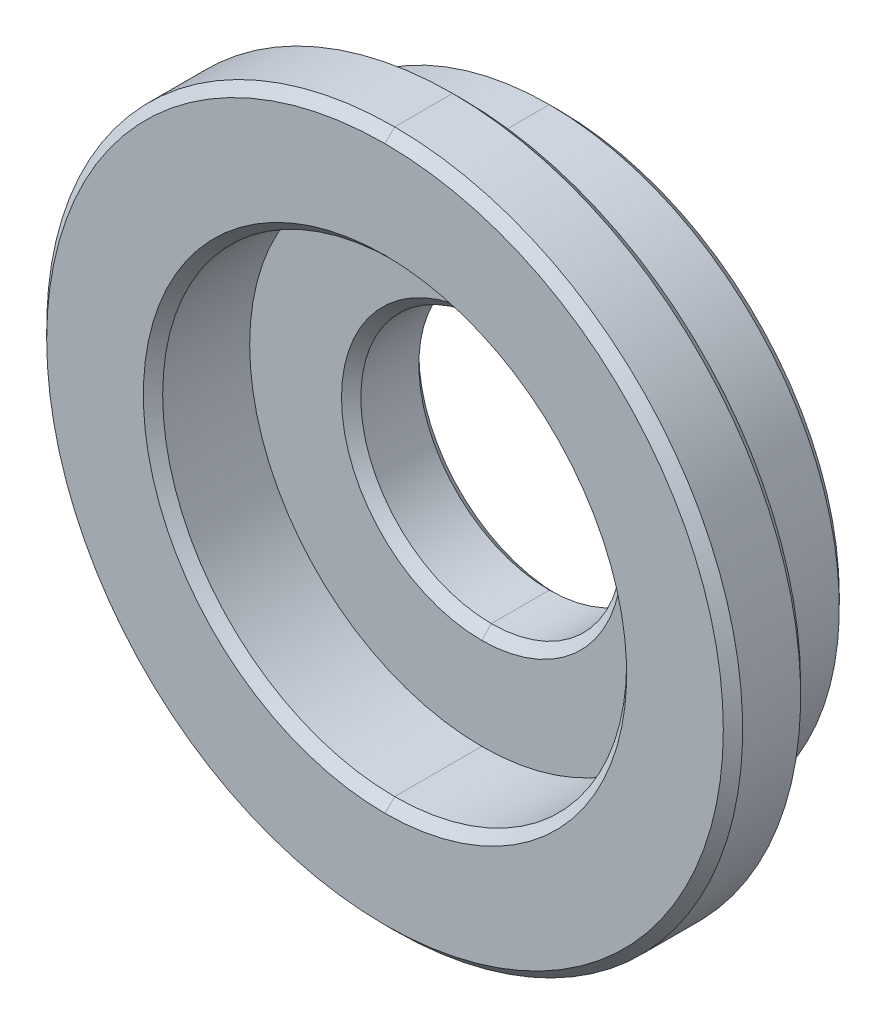
ISO-10303-21;
HEADER;
FILE_DESCRIPTION(('STEP AP214'),'2;1');
FILE_NAME('part.step','',(''),(''),'','','');
FILE_SCHEMA(('AUTOMOTIVE_DESIGN { 1 0 10303 214 1 1 1 1 }'));
ENDSEC;
DATA;
#1=APPLICATION_CONTEXT('core data for automotive mechanical design processes');
#2=APPLICATION_PROTOCOL_DEFINITION('international standard','automotive_design',2000,#1);
#3=PRODUCT_CONTEXT('',#1,'mechanical');
#4=PRODUCT('Part','Part','',(#3));
#5=PRODUCT_RELATED_PRODUCT_CATEGORY('part','',(#4));
#6=PRODUCT_DEFINITION_FORMATION('','',#4);
#7=PRODUCT_DEFINITION_CONTEXT('part definition',#1,'design');
#8=PRODUCT_DEFINITION('design','',#6,#7);
#9=PRODUCT_DEFINITION_SHAPE('','',#8);
#10=(LENGTH_UNIT() NAMED_UNIT(*) SI_UNIT(.MILLI.,.METRE.));
#11=(NAMED_UNIT(*) PLANE_ANGLE_UNIT() SI_UNIT($,.RADIAN.));
#12=(NAMED_UNIT(*) SI_UNIT($,.STERADIAN.) SOLID_ANGLE_UNIT());
#13=UNCERTAINTY_MEASURE_WITH_UNIT(LENGTH_MEASURE(1.E-05),#10,'distance_accuracy_value','');
#14=(GEOMETRIC_REPRESENTATION_CONTEXT(3) GLOBAL_UNCERTAINTY_ASSIGNED_CONTEXT((#13)) GLOBAL_UNIT_ASSIGNED_CONTEXT((#10,
#11,#12)) REPRESENTATION_CONTEXT('',''));
#15=CARTESIAN_POINT('',(0.,0.,0.));
#16=DIRECTION('',(0.,0.,1.));
#17=DIRECTION('',(1.,0.,0.));
#18=AXIS2_PLACEMENT_3D('',#15,#16,#17);
#19=CARTESIAN_POINT('',(0.,0.,-0.25));
#20=DIRECTION('',(0.,0.,1.));
#21=DIRECTION('',(0.,-1.,0.));
#22=AXIS2_PLACEMENT_3D('',#19,#20,#21);
#23=CONICAL_SURFACE('',#22,1.4,0.7853981633973);
#24=DIRECTION('',(0.,-0.707106781186548,0.707106781186548));
#25=VECTOR('',#24,1.);
#26=CARTESIAN_POINT('',(0.,-1.35,-0.3));
#27=LINE('',#26,#25);
#28=CARTESIAN_POINT('',(0.,-1.35,-0.3));
#29=VERTEX_POINT('',#28);
#30=CARTESIAN_POINT('',(0.,-1.45,-0.2));
#31=VERTEX_POINT('',#30);
#32=EDGE_CURVE('E270',#29,#31,#27,.T.);
#33=ORIENTED_EDGE('',*,*,#32,.F.);
#34=CARTESIAN_POINT('',(0.,0.,-0.3));
#35=DIRECTION('',(0.,0.,1.));
#36=DIRECTION('',(0.,1.,0.));
#37=AXIS2_PLACEMENT_3D('',#34,#35,#36);
#38=CIRCLE('',#37,1.35);
#39=CARTESIAN_POINT('',(0.,1.35,-0.3));
#40=VERTEX_POINT('',#39);
#41=EDGE_CURVE('E185',#40,#29,#38,.T.);
#42=ORIENTED_EDGE('',*,*,#41,.F.);
#43=DIRECTION('',(0.,0.707106781186548,0.707106781186548));
#44=VECTOR('',#43,1.);
#45=CARTESIAN_POINT('',(0.,1.35,-0.3));
#46=LINE('',#45,#44);
#47=CARTESIAN_POINT('',(0.,1.45,-0.2));
#48=VERTEX_POINT('',#47);
#49=EDGE_CURVE('E234',#40,#48,#46,.T.);
#50=ORIENTED_EDGE('',*,*,#49,.T.);
#51=CARTESIAN_POINT('',(0.,0.,-0.2));
#52=DIRECTION('',(0.,0.,1.));
#53=DIRECTION('',(0.,1.,0.));
#54=AXIS2_PLACEMENT_3D('',#51,#52,#53);
#55=CIRCLE('',#54,1.45);
#56=EDGE_CURVE('E273',#48,#31,#55,.T.);
#57=ORIENTED_EDGE('',*,*,#56,.T.);
#58=EDGE_LOOP('',(#33,#42,#50,#57));
#59=FACE_BOUND('',#58,.T.);
#60=ADVANCED_FACE('F15',(#59),#23,.F.);
#61=CARTESIAN_POINT('',(0.,0.,0.75));
#62=DIRECTION('',(0.,0.,1.));
#63=DIRECTION('',(0.,-1.,0.));
#64=AXIS2_PLACEMENT_3D('',#61,#62,#63);
#65=CONICAL_SURFACE('',#64,2.45,0.7853981633973);
#66=DIRECTION('',(0.,-0.707106781186548,0.707106781186548));
#67=VECTOR('',#66,1.);
#68=CARTESIAN_POINT('',(0.,-2.4,0.7));
#69=LINE('',#68,#67);
#70=CARTESIAN_POINT('',(0.,-2.4,0.7));
#71=VERTEX_POINT('',#70);
#72=CARTESIAN_POINT('',(0.,-2.5,0.8));
#73=VERTEX_POINT('',#72);
#74=EDGE_CURVE('E295',#71,#73,#69,.T.);
#75=ORIENTED_EDGE('',*,*,#74,.F.);
#76=CARTESIAN_POINT('',(0.,0.,0.7));
#77=DIRECTION('',(0.,0.,1.));
#78=DIRECTION('',(0.,1.,0.));
#79=AXIS2_PLACEMENT_3D('',#76,#77,#78);
#80=CIRCLE('',#79,2.4);
#81=CARTESIAN_POINT('',(0.,2.4,0.7));
#82=VERTEX_POINT('',#81);
#83=EDGE_CURVE('E198',#82,#71,#80,.T.);
#84=ORIENTED_EDGE('',*,*,#83,.F.);
#85=DIRECTION('',(0.,0.707106781186548,0.707106781186548));
#86=VECTOR('',#85,1.);
#87=CARTESIAN_POINT('',(0.,2.4,0.7));
#88=LINE('',#87,#86);
#89=CARTESIAN_POINT('',(0.,2.5,0.8));
#90=VERTEX_POINT('',#89);
#91=EDGE_CURVE('E194',#82,#90,#88,.T.);
#92=ORIENTED_EDGE('',*,*,#91,.T.);
#93=CARTESIAN_POINT('',(0.,0.,0.8));
#94=DIRECTION('',(0.,0.,1.));
#95=DIRECTION('',(0.,1.,0.));
#96=AXIS2_PLACEMENT_3D('',#93,#94,#95);
#97=CIRCLE('',#96,2.5);
#98=EDGE_CURVE('E199',#90,#73,#97,.T.);
#99=ORIENTED_EDGE('',*,*,#98,.T.);
#100=EDGE_LOOP('',(#75,#84,#92,#99));
#101=FACE_BOUND('',#100,.T.);
#102=ADVANCED_FACE('F402',(#101),#65,.F.);
#103=CARTESIAN_POINT('',(0.,0.,0.75));
#104=DIRECTION('',(0.,0.,-1.));
#105=DIRECTION('',(0.,1.,0.));
#106=AXIS2_PLACEMENT_3D('',#103,#104,#105);
#107=CONICAL_SURFACE('',#106,3.55,0.7853981633973);
#108=DIRECTION('',(0.,0.707106781186548,-0.707106781186548));
#109=VECTOR('',#108,1.);
#110=CARTESIAN_POINT('',(0.,3.5,0.8));
#111=LINE('',#110,#109);
#112=CARTESIAN_POINT('',(0.,3.5,0.8));
#113=VERTEX_POINT('',#112);
#114=CARTESIAN_POINT('',(0.,3.6,0.7));
#115=VERTEX_POINT('',#114);
#116=EDGE_CURVE('E211',#113,#115,#111,.T.);
#117=ORIENTED_EDGE('',*,*,#116,.F.);
#118=CARTESIAN_POINT('',(0.,0.,0.8));
#119=DIRECTION('',(0.,0.,-1.));
#120=DIRECTION('',(0.,1.,0.));
#121=AXIS2_PLACEMENT_3D('',#118,#119,#120);
#122=CIRCLE('',#121,3.5);
#123=CARTESIAN_POINT('',(0.,-3.5,0.8));
#124=VERTEX_POINT('',#123);
#125=EDGE_CURVE('E215',#113,#124,#122,.T.);
#126=ORIENTED_EDGE('',*,*,#125,.T.);
#127=DIRECTION('',(0.,-0.707106781186548,-0.707106781186548));
#128=VECTOR('',#127,1.);
#129=CARTESIAN_POINT('',(0.,-3.5,0.8));
#130=LINE('',#129,#128);
#131=CARTESIAN_POINT('',(0.,-3.6,0.7));
#132=VERTEX_POINT('',#131);
#133=EDGE_CURVE('E202',#124,#132,#130,.T.);
#134=ORIENTED_EDGE('',*,*,#133,.T.);
#135=CARTESIAN_POINT('',(0.,0.,0.7));
#136=DIRECTION('',(0.,0.,-1.));
#137=DIRECTION('',(0.,1.,0.));
#138=AXIS2_PLACEMENT_3D('',#135,#136,#137);
#139=CIRCLE('',#138,3.6);
#140=EDGE_CURVE('E284',#115,#132,#139,.T.);
#141=ORIENTED_EDGE('',*,*,#140,.F.);
#142=EDGE_LOOP('',(#117,#126,#134,#141));
#143=FACE_BOUND('',#142,.T.);
#144=ADVANCED_FACE('F407',(#143),#107,.T.);
#145=CARTESIAN_POINT('',(0.,0.,-0.95));
#146=DIRECTION('',(0.,0.,-1.));
#147=DIRECTION('',(0.,1.,0.));
#148=AXIS2_PLACEMENT_3D('',#145,#146,#147);
#149=CONICAL_SURFACE('',#148,1.4,0.7853981633973);
#150=DIRECTION('',(0.,-0.707106781186548,0.707106781186548));
#151=VECTOR('',#150,1.);
#152=CARTESIAN_POINT('',(0.,1.45,-1.));
#153=LINE('',#152,#151);
#154=CARTESIAN_POINT('',(0.,1.45,-1.));
#155=VERTEX_POINT('',#154);
#156=CARTESIAN_POINT('',(0.,1.35,-0.9));
#157=VERTEX_POINT('',#156);
#158=EDGE_CURVE('E10',#155,#157,#153,.T.);
#159=ORIENTED_EDGE('',*,*,#158,.F.);
#160=CARTESIAN_POINT('',(0.,0.,-1.));
#161=DIRECTION('',(0.,0.,-1.));
#162=DIRECTION('',(0.,1.,0.));
#163=AXIS2_PLACEMENT_3D('',#160,#161,#162);
#164=CIRCLE('',#163,1.45);
#165=CARTESIAN_POINT('',(0.,-1.45,-1.));
#166=VERTEX_POINT('',#165);
#167=EDGE_CURVE('E245',#155,#166,#164,.T.);
#168=ORIENTED_EDGE('',*,*,#167,.T.);
#169=DIRECTION('',(0.,0.707106781186548,0.707106781186548));
#170=VECTOR('',#169,1.);
#171=CARTESIAN_POINT('',(0.,-1.45,-1.));
#172=LINE('',#171,#170);
#173=CARTESIAN_POINT('',(0.,-1.35,-0.9));
#174=VERTEX_POINT('',#173);
#175=EDGE_CURVE('E26',#166,#174,#172,.T.);
#176=ORIENTED_EDGE('',*,*,#175,.T.);
#177=CARTESIAN_POINT('',(0.,0.,-0.9));
#178=DIRECTION('',(0.,0.,-1.));
#179=DIRECTION('',(0.,1.,0.));
#180=AXIS2_PLACEMENT_3D('',#177,#178,#179);
#181=CIRCLE('',#180,1.35);
#182=EDGE_CURVE('E159',#157,#174,#181,.T.);
#183=ORIENTED_EDGE('',*,*,#182,.F.);
#184=EDGE_LOOP('',(#159,#168,#176,#183));
#185=FACE_BOUND('',#184,.T.);
#186=ADVANCED_FACE('F161',(#185),#149,.F.);
#187=CARTESIAN_POINT('',(0.,0.,-0.95));
#188=DIRECTION('',(0.,0.,-1.));
#189=DIRECTION('',(0.,1.,0.));
#190=AXIS2_PLACEMENT_3D('',#187,#188,#189);
#191=CONICAL_SURFACE('',#190,1.4,0.7853981633973);
#192=ORIENTED_EDGE('',*,*,#175,.F.);
#193=CARTESIAN_POINT('',(0.,0.,-1.));
#194=DIRECTION('',(0.,0.,-1.));
#195=DIRECTION('',(0.,-1.,0.));
#196=AXIS2_PLACEMENT_3D('',#193,#194,#195);
#197=CIRCLE('',#196,1.45);
#198=EDGE_CURVE('E157',#166,#155,#197,.T.);
#199=ORIENTED_EDGE('',*,*,#198,.T.);
#200=ORIENTED_EDGE('',*,*,#158,.T.);
#201=CARTESIAN_POINT('',(0.,0.,-0.9));
#202=DIRECTION('',(0.,0.,-1.));
#203=DIRECTION('',(0.,-1.,0.));
#204=AXIS2_PLACEMENT_3D('',#201,#202,#203);
#205=CIRCLE('',#204,1.35);
#206=EDGE_CURVE('E155',#174,#157,#205,.T.);
#207=ORIENTED_EDGE('',*,*,#206,.F.);
#208=EDGE_LOOP('',(#192,#199,#200,#207));
#209=FACE_BOUND('',#208,.T.);
#210=ADVANCED_FACE('F153',(#209),#191,.F.);
#211=CARTESIAN_POINT('',(0.,0.,-0.95));
#212=DIRECTION('',(0.,0.,1.));
#213=DIRECTION('',(0.,-1.,0.));
#214=AXIS2_PLACEMENT_3D('',#211,#212,#213);
#215=CONICAL_SURFACE('',#214,2.95,0.7853981633973);
#216=DIRECTION('',(0.,0.707106781186548,-0.707106781186548));
#217=VECTOR('',#216,1.);
#218=CARTESIAN_POINT('',(0.,-3.,-0.9));
#219=LINE('',#218,#217);
#220=CARTESIAN_POINT('',(0.,-3.,-0.9));
#221=VERTEX_POINT('',#220);
#222=CARTESIAN_POINT('',(0.,-2.9,-1.));
#223=VERTEX_POINT('',#222);
#224=EDGE_CURVE('E252',#221,#223,#219,.T.);
#225=ORIENTED_EDGE('',*,*,#224,.F.);
#226=CARTESIAN_POINT('',(0.,0.,-0.9));
#227=DIRECTION('',(0.,0.,1.));
#228=DIRECTION('',(0.,1.,0.));
#229=AXIS2_PLACEMENT_3D('',#226,#227,#228);
#230=CIRCLE('',#229,3.);
#231=CARTESIAN_POINT('',(0.,3.,-0.9));
#232=VERTEX_POINT('',#231);
#233=EDGE_CURVE('E254',#232,#221,#230,.T.);
#234=ORIENTED_EDGE('',*,*,#233,.F.);
#235=DIRECTION('',(0.,-0.707106781186548,-0.707106781186548));
#236=VECTOR('',#235,1.);
#237=CARTESIAN_POINT('',(0.,3.,-0.9));
#238=LINE('',#237,#236);
#239=CARTESIAN_POINT('',(0.,2.9,-1.));
#240=VERTEX_POINT('',#239);
#241=EDGE_CURVE('E266',#232,#240,#238,.T.);
#242=ORIENTED_EDGE('',*,*,#241,.T.);
#243=CARTESIAN_POINT('',(0.,0.,-1.));
#244=DIRECTION('',(0.,0.,1.));
#245=DIRECTION('',(0.,1.,0.));
#246=AXIS2_PLACEMENT_3D('',#243,#244,#245);
#247=CIRCLE('',#246,2.9);
#248=EDGE_CURVE('E248',#240,#223,#247,.T.);
#249=ORIENTED_EDGE('',*,*,#248,.T.);
#250=EDGE_LOOP('',(#225,#234,#242,#249));
#251=FACE_BOUND('',#250,.T.);
#252=ADVANCED_FACE('F367',(#251),#215,.T.);
#253=CARTESIAN_POINT('',(0.,0.,-1.));
#254=DIRECTION('',(0.,0.,1.));
#255=DIRECTION('',(1.,0.,0.));
#256=AXIS2_PLACEMENT_3D('',#253,#254,#255);
#257=PLANE('',#256);
#258=ORIENTED_EDGE('',*,*,#167,.F.);
#259=ORIENTED_EDGE('',*,*,#198,.F.);
#260=EDGE_LOOP('',(#258,#259));
#261=FACE_BOUND('',#260,.T.);
#262=ORIENTED_EDGE('',*,*,#248,.F.);
#263=CARTESIAN_POINT('',(0.,0.,-1.));
#264=DIRECTION('',(0.,0.,1.));
#265=DIRECTION('',(0.,-1.,0.));
#266=AXIS2_PLACEMENT_3D('',#263,#264,#265);
#267=CIRCLE('',#266,2.9);
#268=EDGE_CURVE('E249',#223,#240,#267,.T.);
#269=ORIENTED_EDGE('',*,*,#268,.F.);
#270=EDGE_LOOP('',(#262,#269));
#271=FACE_BOUND('',#270,.T.);
#272=ADVANCED_FACE('F412',(#261,#271),#257,.F.);
#273=CARTESIAN_POINT('',(0.,0.,-0.95));
#274=DIRECTION('',(0.,0.,1.));
#275=DIRECTION('',(0.,-1.,0.));
#276=AXIS2_PLACEMENT_3D('',#273,#274,#275);
#277=CONICAL_SURFACE('',#276,2.95,0.7853981633973);
#278=ORIENTED_EDGE('',*,*,#241,.F.);
#279=CARTESIAN_POINT('',(0.,0.,-0.9));
#280=DIRECTION('',(0.,0.,1.));
#281=DIRECTION('',(0.,-1.,0.));
#282=AXIS2_PLACEMENT_3D('',#279,#280,#281);
#283=CIRCLE('',#282,3.);
#284=EDGE_CURVE('E244',#221,#232,#283,.T.);
#285=ORIENTED_EDGE('',*,*,#284,.F.);
#286=ORIENTED_EDGE('',*,*,#224,.T.);
#287=ORIENTED_EDGE('',*,*,#268,.T.);
#288=EDGE_LOOP('',(#278,#285,#286,#287));
#289=FACE_BOUND('',#288,.T.);
#290=ADVANCED_FACE('F423',(#289),#277,.T.);
#291=CARTESIAN_POINT('',(0.,0.,-1.09));
#292=DIRECTION('',(0.,0.,1.));
#293=DIRECTION('',(0.,-1.,0.));
#294=AXIS2_PLACEMENT_3D('',#291,#292,#293);
#295=CYLINDRICAL_SURFACE('',#294,3.);
#296=CARTESIAN_POINT('',(0.,0.,0.));
#297=DIRECTION('',(0.,0.,-1.));
#298=DIRECTION('',(0.,1.,0.));
#299=AXIS2_PLACEMENT_3D('',#296,#297,#298);
#300=CIRCLE('',#299,3.);
#301=CARTESIAN_POINT('',(0.,3.,0.));
#302=VERTEX_POINT('',#301);
#303=CARTESIAN_POINT('',(0.,-3.,0.));
#304=VERTEX_POINT('',#303);
#305=EDGE_CURVE('E300',#302,#304,#300,.T.);
#306=ORIENTED_EDGE('',*,*,#305,.T.);
#307=DIRECTION('',(0.,0.,1.));
#308=VECTOR('',#307,1.);
#309=CARTESIAN_POINT('',(0.,-3.,-0.9));
#310=LINE('',#309,#308);
#311=EDGE_CURVE('E189',#221,#304,#310,.T.);
#312=ORIENTED_EDGE('',*,*,#311,.F.);
#313=ORIENTED_EDGE('',*,*,#284,.T.);
#314=DIRECTION('',(0.,0.,1.));
#315=VECTOR('',#314,1.);
#316=CARTESIAN_POINT('',(0.,3.,-0.9));
#317=LINE('',#316,#315);
#318=EDGE_CURVE('E133',#232,#302,#317,.T.);
#319=ORIENTED_EDGE('',*,*,#318,.T.);
#320=EDGE_LOOP('',(#306,#312,#313,#319));
#321=FACE_BOUND('',#320,.T.);
#322=ADVANCED_FACE('F356',(#321),#295,.T.);
#323=CARTESIAN_POINT('',(0.,0.,-1.09));
#324=DIRECTION('',(0.,0.,1.));
#325=DIRECTION('',(0.,-1.,0.));
#326=AXIS2_PLACEMENT_3D('',#323,#324,#325);
#327=CYLINDRICAL_SURFACE('',#326,3.);
#328=ORIENTED_EDGE('',*,*,#233,.T.);
#329=ORIENTED_EDGE('',*,*,#311,.T.);
#330=CARTESIAN_POINT('',(0.,0.,0.));
#331=DIRECTION('',(0.,0.,-1.));
#332=DIRECTION('',(0.,-1.,0.));
#333=AXIS2_PLACEMENT_3D('',#330,#331,#332);
#334=CIRCLE('',#333,3.);
#335=EDGE_CURVE('E258',#304,#302,#334,.T.);
#336=ORIENTED_EDGE('',*,*,#335,.T.);
#337=ORIENTED_EDGE('',*,*,#318,.F.);
#338=EDGE_LOOP('',(#328,#329,#336,#337));
#339=FACE_BOUND('',#338,.T.);
#340=ADVANCED_FACE('F361',(#339),#327,.T.);
#341=CARTESIAN_POINT('',(0.,0.,0.05));
#342=DIRECTION('',(0.,0.,1.));
#343=DIRECTION('',(0.,-1.,0.));
#344=AXIS2_PLACEMENT_3D('',#341,#342,#343);
#345=CONICAL_SURFACE('',#344,3.55,0.7853981633973);
#346=DIRECTION('',(0.,0.707106781186498,-0.707106781186598));
#347=VECTOR('',#346,1.);
#348=CARTESIAN_POINT('',(0.,-3.6,0.1));
#349=LINE('',#348,#347);
#350=CARTESIAN_POINT('',(0.,-3.6,0.1));
#351=VERTEX_POINT('',#350);
#352=CARTESIAN_POINT('',(0.,-3.5,0.));
#353=VERTEX_POINT('',#352);
#354=EDGE_CURVE('E262',#351,#353,#349,.T.);
#355=ORIENTED_EDGE('',*,*,#354,.F.);
#356=CARTESIAN_POINT('',(0.,0.,0.1));
#357=DIRECTION('',(0.,0.,1.));
#358=DIRECTION('',(0.,1.,0.));
#359=AXIS2_PLACEMENT_3D('',#356,#357,#358);
#360=CIRCLE('',#359,3.6);
#361=CARTESIAN_POINT('',(0.,3.6,0.1));
#362=VERTEX_POINT('',#361);
#363=EDGE_CURVE('E241',#362,#351,#360,.T.);
#364=ORIENTED_EDGE('',*,*,#363,.F.);
#365=DIRECTION('',(0.,-0.707106781186498,-0.707106781186598));
#366=VECTOR('',#365,1.);
#367=CARTESIAN_POINT('',(0.,3.6,0.1));
#368=LINE('',#367,#366);
#369=CARTESIAN_POINT('',(0.,3.5,0.));
#370=VERTEX_POINT('',#369);
#371=EDGE_CURVE('E259',#362,#370,#368,.T.);
#372=ORIENTED_EDGE('',*,*,#371,.T.);
#373=CARTESIAN_POINT('',(0.,0.,0.));
#374=DIRECTION('',(0.,0.,1.));
#375=DIRECTION('',(0.,1.,0.));
#376=AXIS2_PLACEMENT_3D('',#373,#374,#375);
#377=CIRCLE('',#376,3.5);
#378=EDGE_CURVE('E121',#370,#353,#377,.T.);
#379=ORIENTED_EDGE('',*,*,#378,.T.);
#380=EDGE_LOOP('',(#355,#364,#372,#379));
#381=FACE_BOUND('',#380,.T.);
#382=ADVANCED_FACE('F390',(#381),#345,.T.);
#383=CARTESIAN_POINT('',(0.,0.,0.));
#384=DIRECTION('',(0.,0.,1.));
#385=DIRECTION('',(1.,0.,0.));
#386=AXIS2_PLACEMENT_3D('',#383,#384,#385);
#387=PLANE('',#386);
#388=ORIENTED_EDGE('',*,*,#305,.F.);
#389=ORIENTED_EDGE('',*,*,#335,.F.);
#390=EDGE_LOOP('',(#388,#389));
#391=FACE_BOUND('',#390,.T.);
#392=ORIENTED_EDGE('',*,*,#378,.F.);
#393=CARTESIAN_POINT('',(0.,0.,0.));
#394=DIRECTION('',(0.,0.,1.));
#395=DIRECTION('',(0.,-1.,0.));
#396=AXIS2_PLACEMENT_3D('',#393,#394,#395);
#397=CIRCLE('',#396,3.5);
#398=EDGE_CURVE('E288',#353,#370,#397,.T.);
#399=ORIENTED_EDGE('',*,*,#398,.F.);
#400=EDGE_LOOP('',(#392,#399));
#401=FACE_BOUND('',#400,.T.);
#402=ADVANCED_FACE('F17',(#391,#401),#387,.F.);
#403=CARTESIAN_POINT('',(0.,0.,0.05));
#404=DIRECTION('',(0.,0.,1.));
#405=DIRECTION('',(0.,-1.,0.));
#406=AXIS2_PLACEMENT_3D('',#403,#404,#405);
#407=CONICAL_SURFACE('',#406,3.55,0.7853981633973);
#408=ORIENTED_EDGE('',*,*,#371,.F.);
#409=CARTESIAN_POINT('',(0.,0.,0.1));
#410=DIRECTION('',(0.,0.,1.));
#411=DIRECTION('',(0.,-1.,0.));
#412=AXIS2_PLACEMENT_3D('',#409,#410,#411);
#413=CIRCLE('',#412,3.6);
#414=EDGE_CURVE('E263',#351,#362,#413,.T.);
#415=ORIENTED_EDGE('',*,*,#414,.F.);
#416=ORIENTED_EDGE('',*,*,#354,.T.);
#417=ORIENTED_EDGE('',*,*,#398,.T.);
#418=EDGE_LOOP('',(#408,#415,#416,#417));
#419=FACE_BOUND('',#418,.T.);
#420=ADVANCED_FACE('F380',(#419),#407,.T.);
#421=CARTESIAN_POINT('',(0.,0.,-1.09));
#422=DIRECTION('',(0.,0.,1.));
#423=DIRECTION('',(0.,-1.,0.));
#424=AXIS2_PLACEMENT_3D('',#421,#422,#423);
#425=CYLINDRICAL_SURFACE('',#424,3.6);
#426=ORIENTED_EDGE('',*,*,#140,.T.);
#427=DIRECTION('',(0.,0.,1.));
#428=VECTOR('',#427,1.);
#429=CARTESIAN_POINT('',(0.,-3.6,0.1));
#430=LINE('',#429,#428);
#431=EDGE_CURVE('E19',#351,#132,#430,.T.);
#432=ORIENTED_EDGE('',*,*,#431,.F.);
#433=ORIENTED_EDGE('',*,*,#414,.T.);
#434=DIRECTION('',(0.,0.,1.));
#435=VECTOR('',#434,1.);
#436=CARTESIAN_POINT('',(0.,3.6,0.1));
#437=LINE('',#436,#435);
#438=EDGE_CURVE('E280',#362,#115,#437,.T.);
#439=ORIENTED_EDGE('',*,*,#438,.T.);
#440=EDGE_LOOP('',(#426,#432,#433,#439));
#441=FACE_BOUND('',#440,.T.);
#442=ADVANCED_FACE('F385',(#441),#425,.T.);
#443=CARTESIAN_POINT('',(0.,0.,-1.09));
#444=DIRECTION('',(0.,0.,1.));
#445=DIRECTION('',(0.,-1.,0.));
#446=AXIS2_PLACEMENT_3D('',#443,#444,#445);
#447=CYLINDRICAL_SURFACE('',#446,3.6);
#448=ORIENTED_EDGE('',*,*,#363,.T.);
#449=ORIENTED_EDGE('',*,*,#431,.T.);
#450=CARTESIAN_POINT('',(0.,0.,0.7));
#451=DIRECTION('',(0.,0.,-1.));
#452=DIRECTION('',(0.,-1.,0.));
#453=AXIS2_PLACEMENT_3D('',#450,#451,#452);
#454=CIRCLE('',#453,3.6);
#455=EDGE_CURVE('E237',#132,#115,#454,.T.);
#456=ORIENTED_EDGE('',*,*,#455,.T.);
#457=ORIENTED_EDGE('',*,*,#438,.F.);
#458=EDGE_LOOP('',(#448,#449,#456,#457));
#459=FACE_BOUND('',#458,.T.);
#460=ADVANCED_FACE('F388',(#459),#447,.T.);
#461=CARTESIAN_POINT('',(0.,0.,0.75));
#462=DIRECTION('',(0.,0.,-1.));
#463=DIRECTION('',(0.,1.,0.));
#464=AXIS2_PLACEMENT_3D('',#461,#462,#463);
#465=CONICAL_SURFACE('',#464,3.55,0.7853981633973);
#466=ORIENTED_EDGE('',*,*,#133,.F.);
#467=CARTESIAN_POINT('',(0.,0.,0.8));
#468=DIRECTION('',(0.,0.,-1.));
#469=DIRECTION('',(0.,-1.,0.));
#470=AXIS2_PLACEMENT_3D('',#467,#468,#469);
#471=CIRCLE('',#470,3.5);
#472=EDGE_CURVE('E203',#124,#113,#471,.T.);
#473=ORIENTED_EDGE('',*,*,#472,.T.);
#474=ORIENTED_EDGE('',*,*,#116,.T.);
#475=ORIENTED_EDGE('',*,*,#455,.F.);
#476=EDGE_LOOP('',(#466,#473,#474,#475));
#477=FACE_BOUND('',#476,.T.);
#478=ADVANCED_FACE('F429',(#477),#465,.T.);
#479=CARTESIAN_POINT('',(0.,0.,0.8));
#480=DIRECTION('',(0.,0.,1.));
#481=DIRECTION('',(1.,0.,0.));
#482=AXIS2_PLACEMENT_3D('',#479,#480,#481);
#483=PLANE('',#482);
#484=ORIENTED_EDGE('',*,*,#98,.F.);
#485=CARTESIAN_POINT('',(0.,0.,0.8));
#486=DIRECTION('',(0.,0.,1.));
#487=DIRECTION('',(0.,-1.,0.));
#488=AXIS2_PLACEMENT_3D('',#485,#486,#487);
#489=CIRCLE('',#488,2.5);
#490=EDGE_CURVE('E225',#73,#90,#489,.T.);
#491=ORIENTED_EDGE('',*,*,#490,.F.);
#492=EDGE_LOOP('',(#484,#491));
#493=FACE_BOUND('',#492,.T.);
#494=ORIENTED_EDGE('',*,*,#125,.F.);
#495=ORIENTED_EDGE('',*,*,#472,.F.);
#496=EDGE_LOOP('',(#494,#495));
#497=FACE_BOUND('',#496,.T.);
#498=ADVANCED_FACE('F432',(#493,#497),#483,.T.);
#499=CARTESIAN_POINT('',(0.,0.,0.75));
#500=DIRECTION('',(0.,0.,1.));
#501=DIRECTION('',(0.,-1.,0.));
#502=AXIS2_PLACEMENT_3D('',#499,#500,#501);
#503=CONICAL_SURFACE('',#502,2.45,0.7853981633973);
#504=ORIENTED_EDGE('',*,*,#91,.F.);
#505=CARTESIAN_POINT('',(0.,0.,0.7));
#506=DIRECTION('',(0.,0.,1.));
#507=DIRECTION('',(0.,-1.,0.));
#508=AXIS2_PLACEMENT_3D('',#505,#506,#507);
#509=CIRCLE('',#508,2.4);
#510=EDGE_CURVE('E191',#71,#82,#509,.T.);
#511=ORIENTED_EDGE('',*,*,#510,.F.);
#512=ORIENTED_EDGE('',*,*,#74,.T.);
#513=ORIENTED_EDGE('',*,*,#490,.T.);
#514=EDGE_LOOP('',(#504,#511,#512,#513));
#515=FACE_BOUND('',#514,.T.);
#516=ADVANCED_FACE('F325',(#515),#503,.F.);
#517=CARTESIAN_POINT('',(0.,0.,-1.09));
#518=DIRECTION('',(0.,0.,1.));
#519=DIRECTION('',(0.,-1.,0.));
#520=AXIS2_PLACEMENT_3D('',#517,#518,#519);
#521=CYLINDRICAL_SURFACE('',#520,2.4);
#522=CARTESIAN_POINT('',(0.,0.,-0.2));
#523=DIRECTION('',(0.,0.,-1.));
#524=DIRECTION('',(0.,1.,0.));
#525=AXIS2_PLACEMENT_3D('',#522,#523,#524);
#526=CIRCLE('',#525,2.4);
#527=CARTESIAN_POINT('',(0.,2.4,-0.2));
#528=VERTEX_POINT('',#527);
#529=CARTESIAN_POINT('',(0.,-2.4,-0.2));
#530=VERTEX_POINT('',#529);
#531=EDGE_CURVE('E304',#528,#530,#526,.T.);
#532=ORIENTED_EDGE('',*,*,#531,.T.);
#533=DIRECTION('',(0.,0.,-1.));
#534=VECTOR('',#533,1.);
#535=CARTESIAN_POINT('',(0.,-2.4,0.7));
#536=LINE('',#535,#534);
#537=EDGE_CURVE('E196',#71,#530,#536,.T.);
#538=ORIENTED_EDGE('',*,*,#537,.F.);
#539=ORIENTED_EDGE('',*,*,#510,.T.);
#540=DIRECTION('',(0.,0.,-1.));
#541=VECTOR('',#540,1.);
#542=CARTESIAN_POINT('',(0.,2.4,0.7));
#543=LINE('',#542,#541);
#544=EDGE_CURVE('E195',#82,#528,#543,.T.);
#545=ORIENTED_EDGE('',*,*,#544,.T.);
#546=EDGE_LOOP('',(#532,#538,#539,#545));
#547=FACE_BOUND('',#546,.T.);
#548=ADVANCED_FACE('F321',(#547),#521,.F.);
#549=CARTESIAN_POINT('',(0.,0.,-1.09));
#550=DIRECTION('',(0.,0.,1.));
#551=DIRECTION('',(0.,-1.,0.));
#552=AXIS2_PLACEMENT_3D('',#549,#550,#551);
#553=CYLINDRICAL_SURFACE('',#552,2.4);
#554=ORIENTED_EDGE('',*,*,#83,.T.);
#555=ORIENTED_EDGE('',*,*,#537,.T.);
#556=CARTESIAN_POINT('',(0.,0.,-0.2));
#557=DIRECTION('',(0.,0.,-1.));
#558=DIRECTION('',(0.,-1.,0.));
#559=AXIS2_PLACEMENT_3D('',#556,#557,#558);
#560=CIRCLE('',#559,2.4);
#561=EDGE_CURVE('E277',#530,#528,#560,.T.);
#562=ORIENTED_EDGE('',*,*,#561,.T.);
#563=ORIENTED_EDGE('',*,*,#544,.F.);
#564=EDGE_LOOP('',(#554,#555,#562,#563));
#565=FACE_BOUND('',#564,.T.);
#566=ADVANCED_FACE('F315',(#565),#553,.F.);
#567=CARTESIAN_POINT('',(0.,0.,-0.2));
#568=DIRECTION('',(0.,0.,1.));
#569=DIRECTION('',(1.,0.,0.));
#570=AXIS2_PLACEMENT_3D('',#567,#568,#569);
#571=PLANE('',#570);
#572=ORIENTED_EDGE('',*,*,#56,.F.);
#573=CARTESIAN_POINT('',(0.,0.,-0.2));
#574=DIRECTION('',(0.,0.,1.));
#575=DIRECTION('',(0.,-1.,0.));
#576=AXIS2_PLACEMENT_3D('',#573,#574,#575);
#577=CIRCLE('',#576,1.45);
#578=EDGE_CURVE('E307',#31,#48,#577,.T.);
#579=ORIENTED_EDGE('',*,*,#578,.F.);
#580=EDGE_LOOP('',(#572,#579));
#581=FACE_BOUND('',#580,.T.);
#582=ORIENTED_EDGE('',*,*,#531,.F.);
#583=ORIENTED_EDGE('',*,*,#561,.F.);
#584=EDGE_LOOP('',(#582,#583));
#585=FACE_BOUND('',#584,.T.);
#586=ADVANCED_FACE('F319',(#581,#585),#571,.T.);
#587=CARTESIAN_POINT('',(0.,0.,-0.25));
#588=DIRECTION('',(0.,0.,1.));
#589=DIRECTION('',(0.,-1.,0.));
#590=AXIS2_PLACEMENT_3D('',#587,#588,#589);
#591=CONICAL_SURFACE('',#590,1.4,0.7853981633973);
#592=ORIENTED_EDGE('',*,*,#49,.F.);
#593=CARTESIAN_POINT('',(0.,0.,-0.3));
#594=DIRECTION('',(0.,0.,1.));
#595=DIRECTION('',(0.,-1.,0.));
#596=AXIS2_PLACEMENT_3D('',#593,#594,#595);
#597=CIRCLE('',#596,1.35);
#598=EDGE_CURVE('E165',#29,#40,#597,.T.);
#599=ORIENTED_EDGE('',*,*,#598,.F.);
#600=ORIENTED_EDGE('',*,*,#32,.T.);
#601=ORIENTED_EDGE('',*,*,#578,.T.);
#602=EDGE_LOOP('',(#592,#599,#600,#601));
#603=FACE_BOUND('',#602,.T.);
#604=ADVANCED_FACE('F417',(#603),#591,.F.);
#605=CARTESIAN_POINT('',(0.,0.,-1.09));
#606=DIRECTION('',(0.,0.,1.));
#607=DIRECTION('',(0.,-1.,0.));
#608=AXIS2_PLACEMENT_3D('',#605,#606,#607);
#609=CYLINDRICAL_SURFACE('',#608,1.35);
#610=ORIENTED_EDGE('',*,*,#182,.T.);
#611=DIRECTION('',(0.,0.,-1.));
#612=VECTOR('',#611,1.);
#613=CARTESIAN_POINT('',(0.,-1.35,-0.3));
#614=LINE('',#613,#612);
#615=EDGE_CURVE('E178',#29,#174,#614,.T.);
#616=ORIENTED_EDGE('',*,*,#615,.F.);
#617=ORIENTED_EDGE('',*,*,#598,.T.);
#618=DIRECTION('',(0.,0.,-1.));
#619=VECTOR('',#618,1.);
#620=CARTESIAN_POINT('',(0.,1.35,-0.3));
#621=LINE('',#620,#619);
#622=EDGE_CURVE('E166',#40,#157,#621,.T.);
#623=ORIENTED_EDGE('',*,*,#622,.T.);
#624=EDGE_LOOP('',(#610,#616,#617,#623));
#625=FACE_BOUND('',#624,.T.);
#626=ADVANCED_FACE('F170',(#625),#609,.F.);
#627=CARTESIAN_POINT('',(0.,0.,-1.09));
#628=DIRECTION('',(0.,0.,1.));
#629=DIRECTION('',(0.,-1.,0.));
#630=AXIS2_PLACEMENT_3D('',#627,#628,#629);
#631=CYLINDRICAL_SURFACE('',#630,1.35);
#632=ORIENTED_EDGE('',*,*,#41,.T.);
#633=ORIENTED_EDGE('',*,*,#615,.T.);
#634=ORIENTED_EDGE('',*,*,#206,.T.);
#635=ORIENTED_EDGE('',*,*,#622,.F.);
#636=EDGE_LOOP('',(#632,#633,#634,#635));
#637=FACE_BOUND('',#636,.T.);
#638=ADVANCED_FACE('F177',(#637),#631,.F.);
#639=CLOSED_SHELL('',(#60,#102,#144,#186,#210,#252,#272,#290,#322,#340,#382,#402,#420,#442,#460,
#478,#498,#516,#548,#566,#586,#604,#626,#638));
#640=MANIFOLD_SOLID_BREP('B1',#639);
#641=ADVANCED_BREP_SHAPE_REPRESENTATION('',(#18,#640),#14);
#642=SHAPE_DEFINITION_REPRESENTATION(#9,#641);
ENDSEC;
END-ISO-10303-21;
